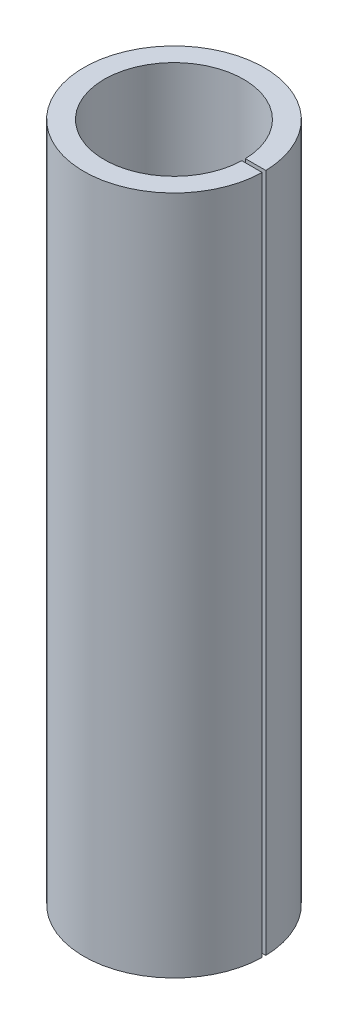
ISO-10303-21;
HEADER;
FILE_DESCRIPTION(('STEP AP214'),'2;1');
FILE_NAME('part.step','',(''),(''),'','','');
FILE_SCHEMA(('AUTOMOTIVE_DESIGN { 1 0 10303 214 1 1 1 1 }'));
ENDSEC;
DATA;
#1=APPLICATION_CONTEXT('core data for automotive mechanical design processes');
#2=APPLICATION_PROTOCOL_DEFINITION('international standard','automotive_design',2000,#1);
#3=PRODUCT_CONTEXT('',#1,'mechanical');
#4=PRODUCT('Part','Part','',(#3));
#5=PRODUCT_RELATED_PRODUCT_CATEGORY('part','',(#4));
#6=PRODUCT_DEFINITION_FORMATION('','',#4);
#7=PRODUCT_DEFINITION_CONTEXT('part definition',#1,'design');
#8=PRODUCT_DEFINITION('design','',#6,#7);
#9=PRODUCT_DEFINITION_SHAPE('','',#8);
#10=(LENGTH_UNIT() NAMED_UNIT(*) SI_UNIT(.MILLI.,.METRE.));
#11=(NAMED_UNIT(*) PLANE_ANGLE_UNIT() SI_UNIT($,.RADIAN.));
#12=(NAMED_UNIT(*) SI_UNIT($,.STERADIAN.) SOLID_ANGLE_UNIT());
#13=UNCERTAINTY_MEASURE_WITH_UNIT(LENGTH_MEASURE(1.E-05),#10,'distance_accuracy_value','');
#14=(GEOMETRIC_REPRESENTATION_CONTEXT(3) GLOBAL_UNCERTAINTY_ASSIGNED_CONTEXT((#13)) GLOBAL_UNIT_ASSIGNED_CONTEXT((#10,
#11,#12)) REPRESENTATION_CONTEXT('',''));
#15=CARTESIAN_POINT('',(0.,0.,0.));
#16=DIRECTION('',(0.,0.,1.));
#17=DIRECTION('',(1.,0.,0.));
#18=AXIS2_PLACEMENT_3D('',#15,#16,#17);
#19=CARTESIAN_POINT('',(5.04825,38.1,0.));
#20=DIRECTION('',(0.,-1.,0.));
#21=DIRECTION('',(0.,0.,-1.));
#22=AXIS2_PLACEMENT_3D('',#19,#20,#21);
#23=PLANE('',#22);
#24=DIRECTION('',(-1.,0.,0.));
#25=VECTOR('',#24,1.);
#26=CARTESIAN_POINT('',(5.3,38.1,0.1));
#27=LINE('',#26,#25);
#28=CARTESIAN_POINT('',(5.04725946058849,38.1,0.1));
#29=VERTEX_POINT('',#28);
#30=CARTESIAN_POINT('',(3.90396946229091,38.1,0.1));
#31=VERTEX_POINT('',#30);
#32=EDGE_CURVE('E54',#29,#31,#27,.T.);
#33=ORIENTED_EDGE('',*,*,#32,.T.);
#34=CARTESIAN_POINT('',(0.,38.1,0.));
#35=DIRECTION('',(0.,1.,0.));
#36=DIRECTION('',(0.,0.,1.));
#37=AXIS2_PLACEMENT_3D('',#34,#35,#36);
#38=CIRCLE('',#37,3.90525);
#39=CARTESIAN_POINT('',(3.90396946229091,38.1,-0.1));
#40=VERTEX_POINT('',#39);
#41=EDGE_CURVE('E85',#40,#31,#38,.T.);
#42=ORIENTED_EDGE('',*,*,#41,.F.);
#43=DIRECTION('',(-1.,0.,0.));
#44=VECTOR('',#43,1.);
#45=CARTESIAN_POINT('',(5.3,38.1,-0.1));
#46=LINE('',#45,#44);
#47=CARTESIAN_POINT('',(5.04725946058849,38.1,-0.1));
#48=VERTEX_POINT('',#47);
#49=EDGE_CURVE('E87',#48,#40,#46,.T.);
#50=ORIENTED_EDGE('',*,*,#49,.F.);
#51=CARTESIAN_POINT('',(0.,38.1,0.));
#52=DIRECTION('',(0.,1.,0.));
#53=DIRECTION('',(0.,0.,1.));
#54=AXIS2_PLACEMENT_3D('',#51,#52,#53);
#55=CIRCLE('',#54,5.04825);
#56=EDGE_CURVE('E78',#48,#29,#55,.T.);
#57=ORIENTED_EDGE('',*,*,#56,.T.);
#58=EDGE_LOOP('',(#33,#42,#50,#57));
#59=FACE_BOUND('',#58,.T.);
#60=ADVANCED_FACE('F33',(#59),#23,.F.);
#61=CARTESIAN_POINT('',(0.,0.,0.));
#62=DIRECTION('',(0.,1.,0.));
#63=DIRECTION('',(0.,0.,1.));
#64=AXIS2_PLACEMENT_3D('',#61,#62,#63);
#65=CYLINDRICAL_SURFACE('',#64,3.90525);
#66=DIRECTION('',(0.,1.,0.));
#67=VECTOR('',#66,1.);
#68=CARTESIAN_POINT('',(3.90396946229091,0.,0.1));
#69=LINE('',#68,#67);
#70=CARTESIAN_POINT('',(3.90396946229091,0.,0.1));
#71=VERTEX_POINT('',#70);
#72=EDGE_CURVE('E70',#71,#31,#69,.T.);
#73=ORIENTED_EDGE('',*,*,#72,.F.);
#74=CARTESIAN_POINT('',(0.,0.,0.));
#75=DIRECTION('',(0.,1.,0.));
#76=DIRECTION('',(0.,0.,1.));
#77=AXIS2_PLACEMENT_3D('',#74,#75,#76);
#78=CIRCLE('',#77,3.90525);
#79=CARTESIAN_POINT('',(3.90396946229091,0.,-0.1));
#80=VERTEX_POINT('',#79);
#81=EDGE_CURVE('E91',#80,#71,#78,.T.);
#82=ORIENTED_EDGE('',*,*,#81,.F.);
#83=DIRECTION('',(0.,1.,0.));
#84=VECTOR('',#83,1.);
#85=CARTESIAN_POINT('',(3.90396946229091,0.,-0.1));
#86=LINE('',#85,#84);
#87=EDGE_CURVE('E79',#40,#80,#86,.F.);
#88=ORIENTED_EDGE('',*,*,#87,.F.);
#89=ORIENTED_EDGE('',*,*,#41,.T.);
#90=EDGE_LOOP('',(#73,#82,#88,#89));
#91=FACE_BOUND('',#90,.T.);
#92=ADVANCED_FACE('F90',(#91),#65,.F.);
#93=CARTESIAN_POINT('',(3.90525,0.,0.));
#94=DIRECTION('',(0.,1.,0.));
#95=DIRECTION('',(0.,0.,1.));
#96=AXIS2_PLACEMENT_3D('',#93,#94,#95);
#97=PLANE('',#96);
#98=DIRECTION('',(-1.,0.,0.));
#99=VECTOR('',#98,1.);
#100=CARTESIAN_POINT('',(5.3,0.,0.1));
#101=LINE('',#100,#99);
#102=CARTESIAN_POINT('',(5.04725946058849,0.,0.1));
#103=VERTEX_POINT('',#102);
#104=EDGE_CURVE('E73',#103,#71,#101,.T.);
#105=ORIENTED_EDGE('',*,*,#104,.F.);
#106=CARTESIAN_POINT('',(0.,0.,0.));
#107=DIRECTION('',(0.,1.,0.));
#108=DIRECTION('',(0.,0.,1.));
#109=AXIS2_PLACEMENT_3D('',#106,#107,#108);
#110=CIRCLE('',#109,5.04825);
#111=CARTESIAN_POINT('',(5.04725946058849,0.,-0.1));
#112=VERTEX_POINT('',#111);
#113=EDGE_CURVE('E93',#112,#103,#110,.T.);
#114=ORIENTED_EDGE('',*,*,#113,.F.);
#115=DIRECTION('',(-1.,0.,0.));
#116=VECTOR('',#115,1.);
#117=CARTESIAN_POINT('',(5.3,0.,-0.1));
#118=LINE('',#117,#116);
#119=EDGE_CURVE('E47',#112,#80,#118,.T.);
#120=ORIENTED_EDGE('',*,*,#119,.T.);
#121=ORIENTED_EDGE('',*,*,#81,.T.);
#122=EDGE_LOOP('',(#105,#114,#120,#121));
#123=FACE_BOUND('',#122,.T.);
#124=ADVANCED_FACE('F107',(#123),#97,.F.);
#125=CARTESIAN_POINT('',(0.,0.,0.));
#126=DIRECTION('',(0.,1.,0.));
#127=DIRECTION('',(0.,0.,1.));
#128=AXIS2_PLACEMENT_3D('',#125,#126,#127);
#129=CYLINDRICAL_SURFACE('',#128,5.04825);
#130=DIRECTION('',(0.,1.,0.));
#131=VECTOR('',#130,1.);
#132=CARTESIAN_POINT('',(5.04725946058849,0.,0.1));
#133=LINE('',#132,#131);
#134=EDGE_CURVE('E11',#29,#103,#133,.F.);
#135=ORIENTED_EDGE('',*,*,#134,.F.);
#136=ORIENTED_EDGE('',*,*,#56,.F.);
#137=DIRECTION('',(0.,1.,0.));
#138=VECTOR('',#137,1.);
#139=CARTESIAN_POINT('',(5.04725946058849,0.,-0.1));
#140=LINE('',#139,#138);
#141=EDGE_CURVE('E40',#112,#48,#140,.T.);
#142=ORIENTED_EDGE('',*,*,#141,.F.);
#143=ORIENTED_EDGE('',*,*,#113,.T.);
#144=EDGE_LOOP('',(#135,#136,#142,#143));
#145=FACE_BOUND('',#144,.T.);
#146=ADVANCED_FACE('F104',(#145),#129,.T.);
#147=CARTESIAN_POINT('',(5.3,0.,-0.1));
#148=DIRECTION('',(0.,0.,1.));
#149=DIRECTION('',(1.,0.,0.));
#150=AXIS2_PLACEMENT_3D('',#147,#148,#149);
#151=PLANE('',#150);
#152=ORIENTED_EDGE('',*,*,#87,.T.);
#153=ORIENTED_EDGE('',*,*,#119,.F.);
#154=ORIENTED_EDGE('',*,*,#141,.T.);
#155=ORIENTED_EDGE('',*,*,#49,.T.);
#156=EDGE_LOOP('',(#152,#153,#154,#155));
#157=FACE_BOUND('',#156,.T.);
#158=ADVANCED_FACE('F102',(#157),#151,.T.);
#159=CARTESIAN_POINT('',(5.3,38.1,0.1));
#160=DIRECTION('',(0.,0.,-1.));
#161=DIRECTION('',(-1.,0.,0.));
#162=AXIS2_PLACEMENT_3D('',#159,#160,#161);
#163=PLANE('',#162);
#164=ORIENTED_EDGE('',*,*,#72,.T.);
#165=ORIENTED_EDGE('',*,*,#32,.F.);
#166=ORIENTED_EDGE('',*,*,#134,.T.);
#167=ORIENTED_EDGE('',*,*,#104,.T.);
#168=EDGE_LOOP('',(#164,#165,#166,#167));
#169=FACE_BOUND('',#168,.T.);
#170=ADVANCED_FACE('F71',(#169),#163,.T.);
#171=CLOSED_SHELL('',(#60,#92,#124,#146,#158,#170));
#172=MANIFOLD_SOLID_BREP('B2',#171);
#173=ADVANCED_BREP_SHAPE_REPRESENTATION('',(#18,#172),#14);
#174=SHAPE_DEFINITION_REPRESENTATION(#9,#173);
ENDSEC;
END-ISO-10303-21;
